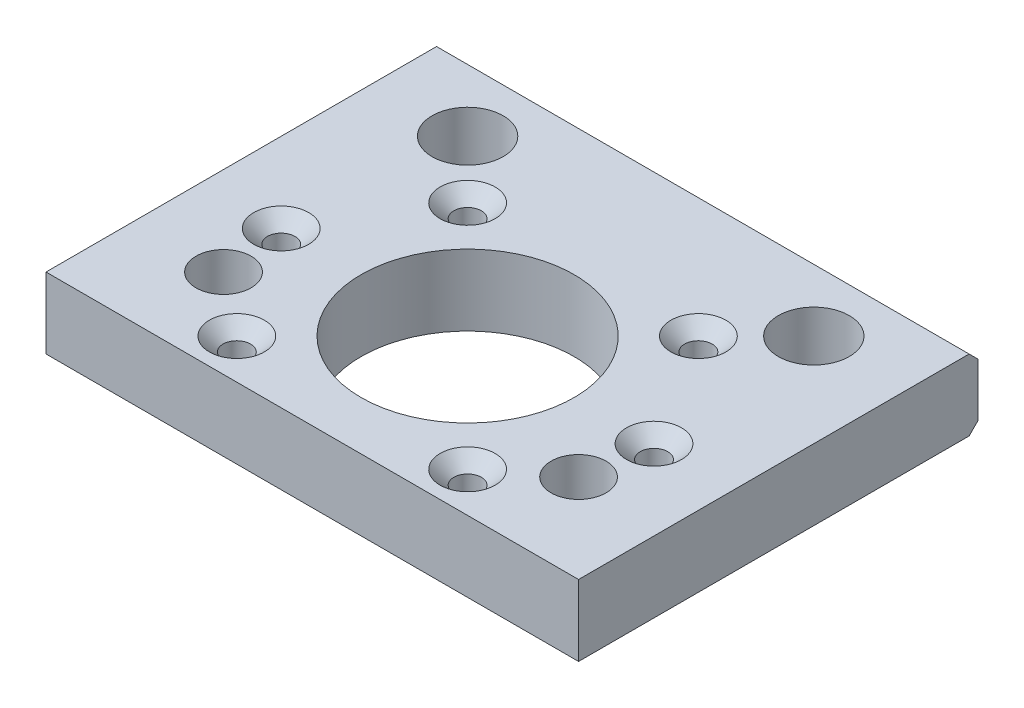
ISO-10303-21;
HEADER;
FILE_DESCRIPTION(('STEP AP214'),'2;1');
FILE_NAME('part.step','',(''),(''),'','','');
FILE_SCHEMA(('AUTOMOTIVE_DESIGN { 1 0 10303 214 1 1 1 1 }'));
ENDSEC;
DATA;
#1=APPLICATION_CONTEXT('core data for automotive mechanical design processes');
#2=APPLICATION_PROTOCOL_DEFINITION('international standard','automotive_design',2000,#1);
#3=PRODUCT_CONTEXT('',#1,'mechanical');
#4=PRODUCT('Part','Part','',(#3));
#5=PRODUCT_RELATED_PRODUCT_CATEGORY('part','',(#4));
#6=PRODUCT_DEFINITION_FORMATION('','',#4);
#7=PRODUCT_DEFINITION_CONTEXT('part definition',#1,'design');
#8=PRODUCT_DEFINITION('design','',#6,#7);
#9=PRODUCT_DEFINITION_SHAPE('','',#8);
#10=(LENGTH_UNIT() NAMED_UNIT(*) SI_UNIT(.MILLI.,.METRE.));
#11=(NAMED_UNIT(*) PLANE_ANGLE_UNIT() SI_UNIT($,.RADIAN.));
#12=(NAMED_UNIT(*) SI_UNIT($,.STERADIAN.) SOLID_ANGLE_UNIT());
#13=UNCERTAINTY_MEASURE_WITH_UNIT(LENGTH_MEASURE(1.E-05),#10,'distance_accuracy_value','');
#14=(GEOMETRIC_REPRESENTATION_CONTEXT(3) GLOBAL_UNCERTAINTY_ASSIGNED_CONTEXT((#13)) GLOBAL_UNIT_ASSIGNED_CONTEXT((#10,
#11,#12)) REPRESENTATION_CONTEXT('',''));
#15=CARTESIAN_POINT('',(0.,0.,0.));
#16=DIRECTION('',(0.,0.,1.));
#17=DIRECTION('',(1.,0.,0.));
#18=AXIS2_PLACEMENT_3D('',#15,#16,#17);
#19=CARTESIAN_POINT('',(0.,8.,0.));
#20=DIRECTION('',(0.,1.,0.));
#21=DIRECTION('',(0.,0.,1.));
#22=AXIS2_PLACEMENT_3D('',#19,#20,#21);
#23=PLANE('',#22);
#24=CARTESIAN_POINT('',(-13.,8.,-8.));
#25=DIRECTION('',(0.,1.,0.));
#26=DIRECTION('',(0.,0.,1.));
#27=AXIS2_PLACEMENT_3D('',#24,#25,#26);
#28=CIRCLE('',#27,3.1);
#29=CARTESIAN_POINT('',(-13.,8.,-4.9));
#30=VERTEX_POINT('',#29);
#31=EDGE_CURVE('E577',#30,#30,#28,.T.);
#32=ORIENTED_EDGE('',*,*,#31,.F.);
#33=EDGE_LOOP('',(#32));
#34=FACE_BOUND('',#33,.T.);
#35=CARTESIAN_POINT('',(-13.,8.,18.));
#36=DIRECTION('',(0.,1.,0.));
#37=DIRECTION('',(0.,0.,1.));
#38=AXIS2_PLACEMENT_3D('',#35,#36,#37);
#39=CIRCLE('',#38,3.1);
#40=CARTESIAN_POINT('',(-13.,8.,21.1));
#41=VERTEX_POINT('',#40);
#42=EDGE_CURVE('E588',#41,#41,#39,.T.);
#43=ORIENTED_EDGE('',*,*,#42,.F.);
#44=EDGE_LOOP('',(#43));
#45=FACE_BOUND('',#44,.T.);
#46=CARTESIAN_POINT('',(13.,8.,18.));
#47=DIRECTION('',(0.,1.,0.));
#48=DIRECTION('',(0.,0.,1.));
#49=AXIS2_PLACEMENT_3D('',#46,#47,#48);
#50=CIRCLE('',#49,3.1);
#51=CARTESIAN_POINT('',(13.,8.,21.1));
#52=VERTEX_POINT('',#51);
#53=EDGE_CURVE('E600',#52,#52,#50,.T.);
#54=ORIENTED_EDGE('',*,*,#53,.F.);
#55=EDGE_LOOP('',(#54));
#56=FACE_BOUND('',#55,.T.);
#57=CARTESIAN_POINT('',(13.,8.,-8.));
#58=DIRECTION('',(0.,1.,0.));
#59=DIRECTION('',(0.,0.,1.));
#60=AXIS2_PLACEMENT_3D('',#57,#58,#59);
#61=CIRCLE('',#60,3.1);
#62=CARTESIAN_POINT('',(13.,8.,-4.9));
#63=VERTEX_POINT('',#62);
#64=EDGE_CURVE('E612',#63,#63,#61,.T.);
#65=ORIENTED_EDGE('',*,*,#64,.F.);
#66=EDGE_LOOP('',(#65));
#67=FACE_BOUND('',#66,.T.);
#68=CARTESIAN_POINT('',(-21.,8.,4.99999999999999));
#69=DIRECTION('',(0.,1.,0.));
#70=DIRECTION('',(0.,0.,1.));
#71=AXIS2_PLACEMENT_3D('',#68,#69,#70);
#72=CIRCLE('',#71,3.1);
#73=CARTESIAN_POINT('',(-21.,8.,8.09999999999999));
#74=VERTEX_POINT('',#73);
#75=EDGE_CURVE('E624',#74,#74,#72,.T.);
#76=ORIENTED_EDGE('',*,*,#75,.F.);
#77=EDGE_LOOP('',(#76));
#78=FACE_BOUND('',#77,.T.);
#79=CARTESIAN_POINT('',(21.,8.,5.));
#80=DIRECTION('',(0.,1.,0.));
#81=DIRECTION('',(0.,0.,1.));
#82=AXIS2_PLACEMENT_3D('',#79,#80,#81);
#83=CIRCLE('',#82,3.1);
#84=CARTESIAN_POINT('',(21.,8.,8.09999999999999));
#85=VERTEX_POINT('',#84);
#86=EDGE_CURVE('E632',#85,#85,#83,.T.);
#87=ORIENTED_EDGE('',*,*,#86,.F.);
#88=EDGE_LOOP('',(#87));
#89=FACE_BOUND('',#88,.T.);
#90=CARTESIAN_POINT('',(20.,8.,12.5));
#91=DIRECTION('',(0.,-1.,0.));
#92=DIRECTION('',(0.,0.,-1.));
#93=AXIS2_PLACEMENT_3D('',#90,#91,#92);
#94=CIRCLE('',#93,3.1);
#95=CARTESIAN_POINT('',(20.,8.,9.4));
#96=VERTEX_POINT('',#95);
#97=EDGE_CURVE('E640',#96,#96,#94,.T.);
#98=ORIENTED_EDGE('',*,*,#97,.T.);
#99=EDGE_LOOP('',(#98));
#100=FACE_BOUND('',#99,.T.);
#101=CARTESIAN_POINT('',(0.,8.,5.));
#102=DIRECTION('',(0.,1.,0.));
#103=DIRECTION('',(0.,0.,1.));
#104=AXIS2_PLACEMENT_3D('',#101,#102,#103);
#105=CIRCLE('',#104,12.);
#106=CARTESIAN_POINT('',(0.,8.,17.));
#107=VERTEX_POINT('',#106);
#108=EDGE_CURVE('E153',#107,#107,#105,.T.);
#109=ORIENTED_EDGE('',*,*,#108,.F.);
#110=EDGE_LOOP('',(#109));
#111=FACE_BOUND('',#110,.T.);
#112=DIRECTION('',(0.,0.,-1.));
#113=VECTOR('',#112,1.);
#114=CARTESIAN_POINT('',(30.,8.,-22.5));
#115=LINE('',#114,#113);
#116=CARTESIAN_POINT('',(30.,8.,22.5));
#117=VERTEX_POINT('',#116);
#118=CARTESIAN_POINT('',(30.,8.,-21.5));
#119=VERTEX_POINT('',#118);
#120=EDGE_CURVE('E167',#117,#119,#115,.T.);
#121=ORIENTED_EDGE('',*,*,#120,.T.);
#122=DIRECTION('',(-1.,0.,0.));
#123=VECTOR('',#122,1.);
#124=CARTESIAN_POINT('',(-30.,8.,-21.5));
#125=LINE('',#124,#123);
#126=CARTESIAN_POINT('',(-30.,8.,-21.5));
#127=VERTEX_POINT('',#126);
#128=EDGE_CURVE('E217',#119,#127,#125,.T.);
#129=ORIENTED_EDGE('',*,*,#128,.T.);
#130=DIRECTION('',(0.,0.,1.));
#131=VECTOR('',#130,1.);
#132=CARTESIAN_POINT('',(-30.,8.,-22.5));
#133=LINE('',#132,#131);
#134=CARTESIAN_POINT('',(-30.,8.,22.5));
#135=VERTEX_POINT('',#134);
#136=EDGE_CURVE('E160',#127,#135,#133,.T.);
#137=ORIENTED_EDGE('',*,*,#136,.T.);
#138=DIRECTION('',(1.,0.,0.));
#139=VECTOR('',#138,1.);
#140=CARTESIAN_POINT('',(-30.,8.,22.5));
#141=LINE('',#140,#139);
#142=EDGE_CURVE('E163',#135,#117,#141,.T.);
#143=ORIENTED_EDGE('',*,*,#142,.T.);
#144=EDGE_LOOP('',(#121,#129,#137,#143));
#145=FACE_BOUND('',#144,.T.);
#146=CARTESIAN_POINT('',(19.5,8.,-14.5));
#147=DIRECTION('',(0.,1.,0.));
#148=DIRECTION('',(0.,0.,-1.));
#149=AXIS2_PLACEMENT_3D('',#146,#147,#148);
#150=CIRCLE('',#149,4.);
#151=CARTESIAN_POINT('',(19.5,8.,-18.5));
#152=VERTEX_POINT('',#151);
#153=EDGE_CURVE('E130',#152,#152,#150,.T.);
#154=ORIENTED_EDGE('',*,*,#153,.F.);
#155=EDGE_LOOP('',(#154));
#156=FACE_BOUND('',#155,.T.);
#157=CARTESIAN_POINT('',(-19.5,8.,-14.5));
#158=DIRECTION('',(0.,1.,0.));
#159=DIRECTION('',(0.,0.,1.));
#160=AXIS2_PLACEMENT_3D('',#157,#158,#159);
#161=CIRCLE('',#160,4.);
#162=CARTESIAN_POINT('',(-19.5,8.,-10.5));
#163=VERTEX_POINT('',#162);
#164=EDGE_CURVE('E142',#163,#163,#161,.T.);
#165=ORIENTED_EDGE('',*,*,#164,.F.);
#166=EDGE_LOOP('',(#165));
#167=FACE_BOUND('',#166,.T.);
#168=CARTESIAN_POINT('',(-20.,8.,12.5));
#169=DIRECTION('',(0.,-1.,0.));
#170=DIRECTION('',(0.,0.,-1.));
#171=AXIS2_PLACEMENT_3D('',#168,#169,#170);
#172=CIRCLE('',#171,3.1);
#173=CARTESIAN_POINT('',(-20.,8.,9.4));
#174=VERTEX_POINT('',#173);
#175=EDGE_CURVE('E124',#174,#174,#172,.T.);
#176=ORIENTED_EDGE('',*,*,#175,.T.);
#177=EDGE_LOOP('',(#176));
#178=FACE_BOUND('',#177,.T.);
#179=ADVANCED_FACE('F40',(#34,#45,#56,#67,#78,#89,#100,#111,#145,#156,#167,#178),#23,.T.);
#180=CARTESIAN_POINT('',(0.,0.,0.));
#181=DIRECTION('',(0.,1.,0.));
#182=DIRECTION('',(0.,0.,1.));
#183=AXIS2_PLACEMENT_3D('',#180,#181,#182);
#184=PLANE('',#183);
#185=CARTESIAN_POINT('',(-13.,0.,-8.));
#186=DIRECTION('',(0.,1.,0.));
#187=DIRECTION('',(0.,0.,1.));
#188=AXIS2_PLACEMENT_3D('',#185,#186,#187);
#189=CIRCLE('',#188,1.55);
#190=CARTESIAN_POINT('',(-13.,0.,-6.45));
#191=VERTEX_POINT('',#190);
#192=EDGE_CURVE('E582',#191,#191,#189,.T.);
#193=ORIENTED_EDGE('',*,*,#192,.T.);
#194=EDGE_LOOP('',(#193));
#195=FACE_BOUND('',#194,.T.);
#196=CARTESIAN_POINT('',(-13.,0.,18.));
#197=DIRECTION('',(0.,1.,0.));
#198=DIRECTION('',(0.,0.,1.));
#199=AXIS2_PLACEMENT_3D('',#196,#197,#198);
#200=CIRCLE('',#199,1.55);
#201=CARTESIAN_POINT('',(-13.,0.,19.55));
#202=VERTEX_POINT('',#201);
#203=EDGE_CURVE('E596',#202,#202,#200,.T.);
#204=ORIENTED_EDGE('',*,*,#203,.T.);
#205=EDGE_LOOP('',(#204));
#206=FACE_BOUND('',#205,.T.);
#207=CARTESIAN_POINT('',(13.,0.,18.));
#208=DIRECTION('',(0.,1.,0.));
#209=DIRECTION('',(0.,0.,1.));
#210=AXIS2_PLACEMENT_3D('',#207,#208,#209);
#211=CIRCLE('',#210,1.55);
#212=CARTESIAN_POINT('',(13.,0.,19.55));
#213=VERTEX_POINT('',#212);
#214=EDGE_CURVE('E608',#213,#213,#211,.T.);
#215=ORIENTED_EDGE('',*,*,#214,.T.);
#216=EDGE_LOOP('',(#215));
#217=FACE_BOUND('',#216,.T.);
#218=CARTESIAN_POINT('',(13.,0.,-8.));
#219=DIRECTION('',(0.,1.,0.));
#220=DIRECTION('',(0.,0.,1.));
#221=AXIS2_PLACEMENT_3D('',#218,#219,#220);
#222=CIRCLE('',#221,1.55);
#223=CARTESIAN_POINT('',(13.,0.,-6.45));
#224=VERTEX_POINT('',#223);
#225=EDGE_CURVE('E620',#224,#224,#222,.T.);
#226=ORIENTED_EDGE('',*,*,#225,.T.);
#227=EDGE_LOOP('',(#226));
#228=FACE_BOUND('',#227,.T.);
#229=CARTESIAN_POINT('',(0.,0.,5.));
#230=DIRECTION('',(0.,1.,0.));
#231=DIRECTION('',(0.,0.,1.));
#232=AXIS2_PLACEMENT_3D('',#229,#230,#231);
#233=CIRCLE('',#232,12.);
#234=CARTESIAN_POINT('',(0.,0.,17.));
#235=VERTEX_POINT('',#234);
#236=EDGE_CURVE('E141',#235,#235,#233,.T.);
#237=ORIENTED_EDGE('',*,*,#236,.T.);
#238=EDGE_LOOP('',(#237));
#239=FACE_BOUND('',#238,.T.);
#240=DIRECTION('',(0.,0.,1.));
#241=VECTOR('',#240,1.);
#242=CARTESIAN_POINT('',(-30.,0.,-22.5));
#243=LINE('',#242,#241);
#244=CARTESIAN_POINT('',(-30.,0.,-21.5));
#245=VERTEX_POINT('',#244);
#246=CARTESIAN_POINT('',(-30.,0.,22.5));
#247=VERTEX_POINT('',#246);
#248=EDGE_CURVE('E157',#245,#247,#243,.T.);
#249=ORIENTED_EDGE('',*,*,#248,.F.);
#250=DIRECTION('',(1.,0.,0.));
#251=VECTOR('',#250,1.);
#252=CARTESIAN_POINT('',(0.,0.,-21.5));
#253=LINE('',#252,#251);
#254=CARTESIAN_POINT('',(30.,0.,-21.5));
#255=VERTEX_POINT('',#254);
#256=EDGE_CURVE('E208',#245,#255,#253,.T.);
#257=ORIENTED_EDGE('',*,*,#256,.T.);
#258=DIRECTION('',(0.,0.,-1.));
#259=VECTOR('',#258,1.);
#260=CARTESIAN_POINT('',(30.,0.,-22.5));
#261=LINE('',#260,#259);
#262=CARTESIAN_POINT('',(30.,0.,22.5));
#263=VERTEX_POINT('',#262);
#264=EDGE_CURVE('E164',#263,#255,#261,.T.);
#265=ORIENTED_EDGE('',*,*,#264,.F.);
#266=DIRECTION('',(1.,0.,0.));
#267=VECTOR('',#266,1.);
#268=CARTESIAN_POINT('',(-30.,0.,22.5));
#269=LINE('',#268,#267);
#270=EDGE_CURVE('E174',#247,#263,#269,.T.);
#271=ORIENTED_EDGE('',*,*,#270,.F.);
#272=EDGE_LOOP('',(#249,#257,#265,#271));
#273=FACE_BOUND('',#272,.T.);
#274=CARTESIAN_POINT('',(21.,0.,5.));
#275=DIRECTION('',(0.,-1.,0.));
#276=DIRECTION('',(0.,0.,-1.));
#277=AXIS2_PLACEMENT_3D('',#274,#275,#276);
#278=CIRCLE('',#277,1.55);
#279=CARTESIAN_POINT('',(19.7416791205615,0.,5.90505721607487));
#280=VERTEX_POINT('',#279);
#281=CARTESIAN_POINT('',(21.9772291763817,0.,6.20313055685089));
#282=VERTEX_POINT('',#281);
#283=EDGE_CURVE('E116',#280,#282,#278,.T.);
#284=ORIENTED_EDGE('',*,*,#283,.F.);
#285=CARTESIAN_POINT('',(20.,0.,12.5));
#286=DIRECTION('',(0.,-1.,0.));
#287=DIRECTION('',(0.,0.,-1.));
#288=AXIS2_PLACEMENT_3D('',#285,#286,#287);
#289=CIRCLE('',#288,6.6);
#290=EDGE_CURVE('E62',#282,#280,#289,.T.);
#291=ORIENTED_EDGE('',*,*,#290,.F.);
#292=EDGE_LOOP('',(#284,#291));
#293=FACE_BOUND('',#292,.T.);
#294=CARTESIAN_POINT('',(-20.,0.,12.5));
#295=DIRECTION('',(0.,-1.,0.));
#296=DIRECTION('',(0.,0.,-1.));
#297=AXIS2_PLACEMENT_3D('',#294,#295,#296);
#298=CIRCLE('',#297,6.6);
#299=CARTESIAN_POINT('',(-19.7416791205615,0.,5.90505721607487));
#300=VERTEX_POINT('',#299);
#301=CARTESIAN_POINT('',(-21.9772291763817,0.,6.20313055685089));
#302=VERTEX_POINT('',#301);
#303=EDGE_CURVE('E68',#300,#302,#298,.T.);
#304=ORIENTED_EDGE('',*,*,#303,.F.);
#305=CARTESIAN_POINT('',(-21.,0.,4.99999999999999));
#306=DIRECTION('',(0.,-1.,0.));
#307=DIRECTION('',(0.,0.,-1.));
#308=AXIS2_PLACEMENT_3D('',#305,#306,#307);
#309=CIRCLE('',#308,1.55);
#310=EDGE_CURVE('E123',#302,#300,#309,.T.);
#311=ORIENTED_EDGE('',*,*,#310,.F.);
#312=EDGE_LOOP('',(#304,#311));
#313=FACE_BOUND('',#312,.T.);
#314=ADVANCED_FACE('F114',(#195,#206,#217,#228,#239,#273,#293,#313),#184,.F.);
#315=CARTESIAN_POINT('',(-30.,8.,-22.5));
#316=DIRECTION('',(1.,0.,0.));
#317=DIRECTION('',(0.,0.,-1.));
#318=AXIS2_PLACEMENT_3D('',#315,#316,#317);
#319=PLANE('',#318);
#320=DIRECTION('',(0.,-1.,0.));
#321=VECTOR('',#320,1.);
#322=CARTESIAN_POINT('',(-30.,8.,-22.5));
#323=LINE('',#322,#321);
#324=CARTESIAN_POINT('',(-30.,7.00000000000001,-22.5));
#325=VERTEX_POINT('',#324);
#326=CARTESIAN_POINT('',(-30.,1.,-22.5));
#327=VERTEX_POINT('',#326);
#328=EDGE_CURVE('E171',#325,#327,#323,.T.);
#329=ORIENTED_EDGE('',*,*,#328,.T.);
#330=DIRECTION('',(0.,0.707106781186545,-0.70710678118655));
#331=VECTOR('',#330,1.);
#332=CARTESIAN_POINT('',(-30.,1.,-22.5));
#333=LINE('',#332,#331);
#334=EDGE_CURVE('E205',#327,#245,#333,.F.);
#335=ORIENTED_EDGE('',*,*,#334,.T.);
#336=ORIENTED_EDGE('',*,*,#248,.T.);
#337=DIRECTION('',(0.,-1.,0.));
#338=VECTOR('',#337,1.);
#339=CARTESIAN_POINT('',(-30.,8.,22.5));
#340=LINE('',#339,#338);
#341=EDGE_CURVE('E191',#135,#247,#340,.T.);
#342=ORIENTED_EDGE('',*,*,#341,.F.);
#343=ORIENTED_EDGE('',*,*,#136,.F.);
#344=DIRECTION('',(0.,-0.707106781186548,-0.707106781186548));
#345=VECTOR('',#344,1.);
#346=CARTESIAN_POINT('',(-30.,8.,-21.5));
#347=LINE('',#346,#345);
#348=EDGE_CURVE('E202',#127,#325,#347,.T.);
#349=ORIENTED_EDGE('',*,*,#348,.T.);
#350=EDGE_LOOP('',(#329,#335,#336,#342,#343,#349));
#351=FACE_BOUND('',#350,.T.);
#352=ADVANCED_FACE('F251',(#351),#319,.F.);
#353=CARTESIAN_POINT('',(-30.,8.,22.5));
#354=DIRECTION('',(0.,0.,-1.));
#355=DIRECTION('',(-1.,0.,0.));
#356=AXIS2_PLACEMENT_3D('',#353,#354,#355);
#357=PLANE('',#356);
#358=ORIENTED_EDGE('',*,*,#270,.T.);
#359=DIRECTION('',(0.,-1.,0.));
#360=VECTOR('',#359,1.);
#361=CARTESIAN_POINT('',(30.,8.,22.5));
#362=LINE('',#361,#360);
#363=EDGE_CURVE('E187',#117,#263,#362,.T.);
#364=ORIENTED_EDGE('',*,*,#363,.F.);
#365=ORIENTED_EDGE('',*,*,#142,.F.);
#366=ORIENTED_EDGE('',*,*,#341,.T.);
#367=EDGE_LOOP('',(#358,#364,#365,#366));
#368=FACE_BOUND('',#367,.T.);
#369=ADVANCED_FACE('F267',(#368),#357,.F.);
#370=CARTESIAN_POINT('',(30.,8.,-22.5));
#371=DIRECTION('',(-1.,0.,0.));
#372=DIRECTION('',(0.,0.,1.));
#373=AXIS2_PLACEMENT_3D('',#370,#371,#372);
#374=PLANE('',#373);
#375=ORIENTED_EDGE('',*,*,#264,.T.);
#376=DIRECTION('',(0.,-0.707106781186545,0.70710678118655));
#377=VECTOR('',#376,1.);
#378=CARTESIAN_POINT('',(30.,1.,-22.5));
#379=LINE('',#378,#377);
#380=CARTESIAN_POINT('',(30.,1.,-22.5));
#381=VERTEX_POINT('',#380);
#382=EDGE_CURVE('E214',#255,#381,#379,.F.);
#383=ORIENTED_EDGE('',*,*,#382,.T.);
#384=DIRECTION('',(0.,-1.,0.));
#385=VECTOR('',#384,1.);
#386=CARTESIAN_POINT('',(30.,8.,-22.5));
#387=LINE('',#386,#385);
#388=CARTESIAN_POINT('',(30.,7.00000000000001,-22.5));
#389=VERTEX_POINT('',#388);
#390=EDGE_CURVE('E183',#389,#381,#387,.T.);
#391=ORIENTED_EDGE('',*,*,#390,.F.);
#392=DIRECTION('',(0.,0.707106781186548,0.707106781186548));
#393=VECTOR('',#392,1.);
#394=CARTESIAN_POINT('',(30.,8.,-21.5));
#395=LINE('',#394,#393);
#396=EDGE_CURVE('E211',#389,#119,#395,.T.);
#397=ORIENTED_EDGE('',*,*,#396,.T.);
#398=ORIENTED_EDGE('',*,*,#120,.F.);
#399=ORIENTED_EDGE('',*,*,#363,.T.);
#400=EDGE_LOOP('',(#375,#383,#391,#397,#398,#399));
#401=FACE_BOUND('',#400,.T.);
#402=ADVANCED_FACE('F263',(#401),#374,.F.);
#403=CARTESIAN_POINT('',(-30.,8.,-22.5));
#404=DIRECTION('',(0.,0.,1.));
#405=DIRECTION('',(1.,0.,0.));
#406=AXIS2_PLACEMENT_3D('',#403,#404,#405);
#407=PLANE('',#406);
#408=ORIENTED_EDGE('',*,*,#390,.T.);
#409=DIRECTION('',(-1.,0.,0.));
#410=VECTOR('',#409,1.);
#411=CARTESIAN_POINT('',(-30.,1.,-22.5));
#412=LINE('',#411,#410);
#413=EDGE_CURVE('E198',#381,#327,#412,.T.);
#414=ORIENTED_EDGE('',*,*,#413,.T.);
#415=ORIENTED_EDGE('',*,*,#328,.F.);
#416=DIRECTION('',(1.,0.,0.));
#417=VECTOR('',#416,1.);
#418=CARTESIAN_POINT('',(30.,7.00000000000001,-22.5));
#419=LINE('',#418,#417);
#420=EDGE_CURVE('E195',#325,#389,#419,.T.);
#421=ORIENTED_EDGE('',*,*,#420,.T.);
#422=EDGE_LOOP('',(#408,#414,#415,#421));
#423=FACE_BOUND('',#422,.T.);
#424=ADVANCED_FACE('F260',(#423),#407,.F.);
#425=CARTESIAN_POINT('',(0.,8.,5.));
#426=DIRECTION('',(0.,-1.,0.));
#427=DIRECTION('',(0.,0.,-1.));
#428=AXIS2_PLACEMENT_3D('',#425,#426,#427);
#429=CYLINDRICAL_SURFACE('',#428,12.);
#430=ORIENTED_EDGE('',*,*,#108,.T.);
#431=EDGE_LOOP('',(#430));
#432=FACE_BOUND('',#431,.T.);
#433=ORIENTED_EDGE('',*,*,#236,.F.);
#434=EDGE_LOOP('',(#433));
#435=FACE_BOUND('',#434,.T.);
#436=ADVANCED_FACE('F257',(#432,#435),#429,.F.);
#437=CARTESIAN_POINT('',(-30.,1.,-22.5));
#438=DIRECTION('',(0.,0.70710678118655,0.707106781186545));
#439=DIRECTION('',(-1.,0.,0.));
#440=AXIS2_PLACEMENT_3D('',#437,#438,#439);
#441=PLANE('',#440);
#442=ORIENTED_EDGE('',*,*,#382,.F.);
#443=ORIENTED_EDGE('',*,*,#256,.F.);
#444=ORIENTED_EDGE('',*,*,#334,.F.);
#445=ORIENTED_EDGE('',*,*,#413,.F.);
#446=EDGE_LOOP('',(#442,#443,#444,#445));
#447=FACE_BOUND('',#446,.T.);
#448=ADVANCED_FACE('F275',(#447),#441,.F.);
#449=CARTESIAN_POINT('',(0.,8.,-21.5));
#450=DIRECTION('',(0.,0.707106781186547,-0.707106781186547));
#451=DIRECTION('',(1.,0.,0.));
#452=AXIS2_PLACEMENT_3D('',#449,#450,#451);
#453=PLANE('',#452);
#454=ORIENTED_EDGE('',*,*,#396,.F.);
#455=ORIENTED_EDGE('',*,*,#420,.F.);
#456=ORIENTED_EDGE('',*,*,#348,.F.);
#457=ORIENTED_EDGE('',*,*,#128,.F.);
#458=EDGE_LOOP('',(#454,#455,#456,#457));
#459=FACE_BOUND('',#458,.T.);
#460=ADVANCED_FACE('F43',(#459),#453,.T.);
#461=CARTESIAN_POINT('',(19.5,2.,-14.5));
#462=DIRECTION('',(0.,1.,0.));
#463=DIRECTION('',(0.,0.,1.));
#464=AXIS2_PLACEMENT_3D('',#461,#462,#463);
#465=CYLINDRICAL_SURFACE('',#464,4.);
#466=CARTESIAN_POINT('',(19.5,2.,-14.5));
#467=DIRECTION('',(0.,1.,0.));
#468=DIRECTION('',(0.,0.,-1.));
#469=AXIS2_PLACEMENT_3D('',#466,#467,#468);
#470=CIRCLE('',#469,4.);
#471=CARTESIAN_POINT('',(19.5,2.,-18.5));
#472=VERTEX_POINT('',#471);
#473=EDGE_CURVE('E146',#472,#472,#470,.T.);
#474=ORIENTED_EDGE('',*,*,#473,.F.);
#475=EDGE_LOOP('',(#474));
#476=FACE_BOUND('',#475,.T.);
#477=ORIENTED_EDGE('',*,*,#153,.T.);
#478=EDGE_LOOP('',(#477));
#479=FACE_BOUND('',#478,.T.);
#480=ADVANCED_FACE('F284',(#476,#479),#465,.F.);
#481=CARTESIAN_POINT('',(19.5,2.,-14.5));
#482=DIRECTION('',(0.,-1.,0.));
#483=DIRECTION('',(0.,0.,-1.));
#484=AXIS2_PLACEMENT_3D('',#481,#482,#483);
#485=PLANE('',#484);
#486=ORIENTED_EDGE('',*,*,#473,.T.);
#487=EDGE_LOOP('',(#486));
#488=FACE_BOUND('',#487,.T.);
#489=ADVANCED_FACE('F314',(#488),#485,.F.);
#490=CARTESIAN_POINT('',(-19.5,2.,-14.5));
#491=DIRECTION('',(0.,1.,0.));
#492=DIRECTION('',(0.,0.,1.));
#493=AXIS2_PLACEMENT_3D('',#490,#491,#492);
#494=CYLINDRICAL_SURFACE('',#493,4.);
#495=CARTESIAN_POINT('',(-19.5,2.,-14.5));
#496=DIRECTION('',(0.,1.,0.));
#497=DIRECTION('',(0.,0.,1.));
#498=AXIS2_PLACEMENT_3D('',#495,#496,#497);
#499=CIRCLE('',#498,4.);
#500=CARTESIAN_POINT('',(-19.5,2.,-10.5));
#501=VERTEX_POINT('',#500);
#502=EDGE_CURVE('E137',#501,#501,#499,.T.);
#503=ORIENTED_EDGE('',*,*,#502,.F.);
#504=EDGE_LOOP('',(#503));
#505=FACE_BOUND('',#504,.T.);
#506=ORIENTED_EDGE('',*,*,#164,.T.);
#507=EDGE_LOOP('',(#506));
#508=FACE_BOUND('',#507,.T.);
#509=ADVANCED_FACE('F311',(#505,#508),#494,.F.);
#510=CARTESIAN_POINT('',(-19.5,2.,-14.5));
#511=DIRECTION('',(0.,1.,0.));
#512=DIRECTION('',(0.,0.,1.));
#513=AXIS2_PLACEMENT_3D('',#510,#511,#512);
#514=PLANE('',#513);
#515=ORIENTED_EDGE('',*,*,#502,.T.);
#516=EDGE_LOOP('',(#515));
#517=FACE_BOUND('',#516,.T.);
#518=ADVANCED_FACE('F313',(#517),#514,.T.);
#519=CARTESIAN_POINT('',(-21.,8.,4.99999999999999));
#520=DIRECTION('',(0.,-1.,0.));
#521=DIRECTION('',(0.,0.,-1.));
#522=AXIS2_PLACEMENT_3D('',#519,#520,#521);
#523=CYLINDRICAL_SURFACE('',#522,1.55);
#524=CARTESIAN_POINT('',(-21.,6.45,4.99999999999999));
#525=DIRECTION('',(0.,1.,0.));
#526=DIRECTION('',(0.,0.,1.));
#527=AXIS2_PLACEMENT_3D('',#524,#525,#526);
#528=CIRCLE('',#527,1.55);
#529=CARTESIAN_POINT('',(-21.,6.45,6.54999999999999));
#530=VERTEX_POINT('',#529);
#531=EDGE_CURVE('E628',#530,#530,#528,.T.);
#532=ORIENTED_EDGE('',*,*,#531,.T.);
#533=EDGE_LOOP('',(#532));
#534=FACE_BOUND('',#533,.T.);
#535=ORIENTED_EDGE('',*,*,#310,.T.);
#536=CARTESIAN_POINT('',(-19.7415391265259,-0.000200000000024039,5.90486254753676));
#537=CARTESIAN_POINT('',(-19.7640789068499,0.0319894737143906,5.93619795089192));
#538=CARTESIAN_POINT('',(-19.7880416176144,0.0636733057572304,5.96706586171109));
#539=CARTESIAN_POINT('',(-19.8390240945423,0.125769647960979,6.02772307652768));
#540=CARTESIAN_POINT('',(-19.8660508952858,0.156179003819942,6.05750968246368));
#541=CARTESIAN_POINT('',(-19.9236645255164,0.215721579254156,6.11611455912));
#542=CARTESIAN_POINT('',(-19.9542954555677,0.244831307330216,6.14491371835946));
#543=CARTESIAN_POINT('',(-20.018933037301,0.30081666426608,6.20076257200955));
#544=CARTESIAN_POINT('',(-20.0529363481758,0.327694456602378,6.22781395480496));
#545=CARTESIAN_POINT('',(-20.1368743384404,0.387503327612693,6.28882043715936));
#546=CARTESIAN_POINT('',(-20.1882525988424,0.419314557887482,6.32192895669979));
#547=CARTESIAN_POINT('',(-20.2972645917743,0.475976739495551,6.3829447926227));
#548=CARTESIAN_POINT('',(-20.3548679987553,0.500859493640095,6.41087567074627));
#549=CARTESIAN_POINT('',(-20.4658404607515,0.538366743974371,6.45607184442366));
#550=CARTESIAN_POINT('',(-20.5183400124542,0.552336397456293,6.47433653496691));
#551=CARTESIAN_POINT('',(-20.6263664302082,0.5729575489194,6.5053401144818));
#552=CARTESIAN_POINT('',(-20.6818928220637,0.579610189771966,6.51807986622582));
#553=CARTESIAN_POINT('',(-20.794546357043,0.584953808552159,6.53738803287034));
#554=CARTESIAN_POINT('',(-20.8516773203954,0.583623835971915,6.54394015609076));
#555=CARTESIAN_POINT('',(-20.9655790335481,0.573089407496946,6.55066882768448));
#556=CARTESIAN_POINT('',(-21.022349671927,0.563882625017967,6.55084349167297));
#557=CARTESIAN_POINT('',(-21.1319702739787,0.538904178426314,6.5453136139675));
#558=CARTESIAN_POINT('',(-21.1848879027368,0.523375152786903,6.53981592351621));
#559=CARTESIAN_POINT('',(-21.28800688623,0.486873958704777,6.52390249089246));
#560=CARTESIAN_POINT('',(-21.3382069672266,0.465899264071793,6.51348446438426));
#561=CARTESIAN_POINT('',(-21.4640454616568,0.405961867515555,6.48105477578378));
#562=CARTESIAN_POINT('',(-21.5372702369398,0.363677076102752,6.45582832177987));
#563=CARTESIAN_POINT('',(-21.6753529096649,0.271657077928422,6.39716050490047));
#564=CARTESIAN_POINT('',(-21.740184819951,0.221899714632767,6.3636945160847));
#565=CARTESIAN_POINT('',(-21.8325948840162,0.142473354340882,6.30791918027166));
#566=CARTESIAN_POINT('',(-21.8631674945138,0.114570640367513,6.28792322003507));
#567=CARTESIAN_POINT('',(-21.9219636599746,0.0578511624255341,6.24650114434565));
#568=CARTESIAN_POINT('',(-21.9502011455105,0.0290414882151986,6.22508512940579));
#569=CARTESIAN_POINT('',(-21.9774152846532,-0.000200000000002196,6.20297936862042));
#570=B_SPLINE_CURVE_WITH_KNOTS('',3,(#536,#537,#538,#539,#540,#541,#542,#543,#544,#545,#546,
#547,#548,#549,#550,#551,#552,#553,#554,#555,#556,#557,#558,#559,#560,#561,#562,#563,#564,#565,
#566,#567,#568,#569),.UNSPECIFIED.,.F.,.F.,(4,2,2,2,2,2,2,2,2,2,2,2,2,2,2,2,4),(0.,
0.150789838653387,0.301933154371546,0.455168650018706,0.608253832961076,0.814264779764228,
1.01931390042089,1.19053104544893,1.36172144363561,1.53336133011887,1.70505193162313,
1.87069552341398,2.03641609329825,2.29965430210396,2.56368902455773,2.70151744881648,
2.83845327778439),.UNSPECIFIED.);
#571=EDGE_CURVE('E56',#300,#302,#570,.T.);
#572=ORIENTED_EDGE('',*,*,#571,.T.);
#573=EDGE_LOOP('',(#535,#572));
#574=FACE_BOUND('',#573,.T.);
#575=ADVANCED_FACE('F227',(#534,#574),#523,.F.);
#576=CARTESIAN_POINT('',(21.,8.,5.));
#577=DIRECTION('',(0.,-1.,0.));
#578=DIRECTION('',(0.,0.,-1.));
#579=AXIS2_PLACEMENT_3D('',#576,#577,#578);
#580=CYLINDRICAL_SURFACE('',#579,1.55);
#581=CARTESIAN_POINT('',(21.,6.45,5.));
#582=DIRECTION('',(0.,1.,0.));
#583=DIRECTION('',(0.,0.,1.));
#584=AXIS2_PLACEMENT_3D('',#581,#582,#583);
#585=CIRCLE('',#584,1.55);
#586=CARTESIAN_POINT('',(21.,6.45,6.55));
#587=VERTEX_POINT('',#586);
#588=EDGE_CURVE('E119',#587,#587,#585,.T.);
#589=ORIENTED_EDGE('',*,*,#588,.T.);
#590=EDGE_LOOP('',(#589));
#591=FACE_BOUND('',#590,.T.);
#592=ORIENTED_EDGE('',*,*,#283,.T.);
#593=CARTESIAN_POINT('',(21.9774152846532,-0.000200000000002385,6.20297936862042));
#594=CARTESIAN_POINT('',(21.947452770885,0.0319894737144118,6.22731446609662));
#595=CARTESIAN_POINT('',(21.9162395231639,0.0636733057572498,6.25082558245104));
#596=CARTESIAN_POINT('',(21.8511453734257,0.125769647960995,6.29600591371215));
#597=CARTESIAN_POINT('',(21.8172583894935,0.156179003819957,6.31767068169138));
#598=CARTESIAN_POINT('',(21.7463024729855,0.215721579254169,6.35913295211589));
#599=CARTESIAN_POINT('',(21.7091959878514,0.24483130733023,6.3789004559973));
#600=CARTESIAN_POINT('',(21.6321836001568,0.300816664266093,6.415862647057));
#601=CARTESIAN_POINT('',(21.5922804793225,0.32769445660239,6.43305983895786));
#602=CARTESIAN_POINT('',(21.495290589411,0.387503327612703,6.46994260395545));
#603=CARTESIAN_POINT('',(21.4370324814579,0.419314557887493,6.48843294104853));
#604=CARTESIAN_POINT('',(21.3158420858537,0.475976739495563,6.51875512516663));
#605=CARTESIAN_POINT('',(21.252932890962,0.500859493640106,6.53061765637383));
#606=CARTESIAN_POINT('',(21.1339954039673,0.538366743974381,6.54515917018578));
#607=CARTESIAN_POINT('',(21.0785443892996,0.552336397456303,6.54903045187964));
#608=CARTESIAN_POINT('',(20.9661686115942,0.572957548919409,6.55064707199995));
#609=CARTESIAN_POINT('',(20.9092440801327,0.579610189771974,6.5483933673017));
#610=CARTESIAN_POINT('',(20.7954671315339,0.584953808552166,6.53751080280247));
#611=CARTESIAN_POINT('',(20.7386152961885,0.583623835971922,6.52886521952984));
#612=CARTESIAN_POINT('',(20.626929711462,0.573089407496951,6.50551558473967));
#613=CARTESIAN_POINT('',(20.5720965633351,0.563882625017972,6.49080974386072));
#614=CARTESIAN_POINT('',(20.4677543782212,0.538904178426317,6.45675149453315));
#615=CARTESIAN_POINT('',(20.4181258431625,0.523375152786906,6.43758098223964));
#616=CARTESIAN_POINT('',(20.3227787279023,0.486873958704779,6.39520540311544));
#617=CARTESIAN_POINT('',(20.2770619754579,0.465899264071794,6.37199846548177));
#618=CARTESIAN_POINT('',(20.1641164472786,0.405961867515554,6.30773090720002));
#619=CARTESIAN_POINT('',(20.1000592940153,0.36367707610275,6.26420019605659));
#620=CARTESIAN_POINT('',(19.9821719505241,0.271657077928417,6.17140304368169));
#621=CARTESIAN_POINT('',(19.9283732918155,0.221899714632759,6.12211964566664));
#622=CARTESIAN_POINT('',(19.8538051520355,0.142473354340871,6.04408054934089));
#623=CARTESIAN_POINT('',(19.8295396965517,0.1145706403675,6.01677284697344));
#624=CARTESIAN_POINT('',(19.7836504912003,0.0578511624255185,5.9613927218424));
#625=CARTESIAN_POINT('',(19.7620106509949,0.0290414882151811,5.93332639680368));
#626=CARTESIAN_POINT('',(19.7415391265259,-0.000200000000022685,5.90486254753676));
#627=B_SPLINE_CURVE_WITH_KNOTS('',3,(#593,#594,#595,#596,#597,#598,#599,#600,#601,#602,#603,
#604,#605,#606,#607,#608,#609,#610,#611,#612,#613,#614,#615,#616,#617,#618,#619,#620,#621,#622,
#623,#624,#625,#626),.UNSPECIFIED.,.F.,.F.,(4,2,2,2,2,2,2,2,2,2,2,2,2,2,2,2,4),(0.,
0.150789838653381,0.301933154371538,0.455168650018694,0.608253832961064,0.814264779764215,
1.01931390042088,1.19053104544892,1.3617214436356,1.53336133011886,1.70505193162313,
1.87069552341398,2.03641609329825,2.29965430210396,2.56368902455774,2.70151744881649,
2.83845327778442),.UNSPECIFIED.);
#628=EDGE_CURVE('E11',#282,#280,#627,.T.);
#629=ORIENTED_EDGE('',*,*,#628,.T.);
#630=EDGE_LOOP('',(#592,#629));
#631=FACE_BOUND('',#630,.T.);
#632=ADVANCED_FACE('F121',(#591,#631),#580,.F.);
#633=CARTESIAN_POINT('',(-20.,0.,12.5));
#634=DIRECTION('',(0.,-1.,0.));
#635=DIRECTION('',(0.,0.,-1.));
#636=AXIS2_PLACEMENT_3D('',#633,#634,#635);
#637=CONICAL_SURFACE('',#636,6.6,0.785398163397449);
#638=CARTESIAN_POINT('',(-20.,3.5,12.5));
#639=DIRECTION('',(0.,-1.,0.));
#640=DIRECTION('',(0.,0.,-1.));
#641=AXIS2_PLACEMENT_3D('',#638,#639,#640);
#642=CIRCLE('',#641,3.1);
#643=CARTESIAN_POINT('',(-20.,3.5,9.4));
#644=VERTEX_POINT('',#643);
#645=EDGE_CURVE('E134',#644,#644,#642,.T.);
#646=ORIENTED_EDGE('',*,*,#645,.F.);
#647=EDGE_LOOP('',(#646));
#648=FACE_BOUND('',#647,.T.);
#649=ORIENTED_EDGE('',*,*,#303,.T.);
#650=ORIENTED_EDGE('',*,*,#571,.F.);
#651=EDGE_LOOP('',(#649,#650));
#652=FACE_BOUND('',#651,.T.);
#653=ADVANCED_FACE('F230',(#648,#652),#637,.F.);
#654=CARTESIAN_POINT('',(-20.,0.,12.5));
#655=DIRECTION('',(0.,-1.,0.));
#656=DIRECTION('',(0.,0.,-1.));
#657=AXIS2_PLACEMENT_3D('',#654,#655,#656);
#658=CYLINDRICAL_SURFACE('',#657,3.1);
#659=ORIENTED_EDGE('',*,*,#175,.F.);
#660=EDGE_LOOP('',(#659));
#661=FACE_BOUND('',#660,.T.);
#662=ORIENTED_EDGE('',*,*,#645,.T.);
#663=EDGE_LOOP('',(#662));
#664=FACE_BOUND('',#663,.T.);
#665=ADVANCED_FACE('F234',(#661,#664),#658,.F.);
#666=CARTESIAN_POINT('',(20.,0.,12.5));
#667=DIRECTION('',(0.,-1.,0.));
#668=DIRECTION('',(0.,0.,-1.));
#669=AXIS2_PLACEMENT_3D('',#666,#667,#668);
#670=CONICAL_SURFACE('',#669,6.6,0.785398163397449);
#671=CARTESIAN_POINT('',(20.,3.5,12.5));
#672=DIRECTION('',(0.,-1.,0.));
#673=DIRECTION('',(0.,0.,-1.));
#674=AXIS2_PLACEMENT_3D('',#671,#672,#673);
#675=CIRCLE('',#674,3.1);
#676=CARTESIAN_POINT('',(20.,3.5,9.4));
#677=VERTEX_POINT('',#676);
#678=EDGE_CURVE('E118',#677,#677,#675,.T.);
#679=ORIENTED_EDGE('',*,*,#678,.F.);
#680=EDGE_LOOP('',(#679));
#681=FACE_BOUND('',#680,.T.);
#682=ORIENTED_EDGE('',*,*,#290,.T.);
#683=ORIENTED_EDGE('',*,*,#628,.F.);
#684=EDGE_LOOP('',(#682,#683));
#685=FACE_BOUND('',#684,.T.);
#686=ADVANCED_FACE('F109',(#681,#685),#670,.F.);
#687=CARTESIAN_POINT('',(20.,0.,12.5));
#688=DIRECTION('',(0.,-1.,0.));
#689=DIRECTION('',(0.,0.,-1.));
#690=AXIS2_PLACEMENT_3D('',#687,#688,#689);
#691=CYLINDRICAL_SURFACE('',#690,3.1);
#692=ORIENTED_EDGE('',*,*,#97,.F.);
#693=EDGE_LOOP('',(#692));
#694=FACE_BOUND('',#693,.T.);
#695=ORIENTED_EDGE('',*,*,#678,.T.);
#696=EDGE_LOOP('',(#695));
#697=FACE_BOUND('',#696,.T.);
#698=ADVANCED_FACE('F236',(#694,#697),#691,.F.);
#699=CARTESIAN_POINT('',(21.,8.,5.));
#700=DIRECTION('',(0.,1.,0.));
#701=DIRECTION('',(0.,0.,1.));
#702=AXIS2_PLACEMENT_3D('',#699,#700,#701);
#703=CONICAL_SURFACE('',#702,3.1,0.785398163397447);
#704=ORIENTED_EDGE('',*,*,#588,.F.);
#705=EDGE_LOOP('',(#704));
#706=FACE_BOUND('',#705,.T.);
#707=ORIENTED_EDGE('',*,*,#86,.T.);
#708=EDGE_LOOP('',(#707));
#709=FACE_BOUND('',#708,.T.);
#710=ADVANCED_FACE('F381',(#706,#709),#703,.F.);
#711=CARTESIAN_POINT('',(-21.,8.,4.99999999999999));
#712=DIRECTION('',(0.,1.,0.));
#713=DIRECTION('',(0.,0.,1.));
#714=AXIS2_PLACEMENT_3D('',#711,#712,#713);
#715=CONICAL_SURFACE('',#714,3.1,0.785398163397447);
#716=ORIENTED_EDGE('',*,*,#531,.F.);
#717=EDGE_LOOP('',(#716));
#718=FACE_BOUND('',#717,.T.);
#719=ORIENTED_EDGE('',*,*,#75,.T.);
#720=EDGE_LOOP('',(#719));
#721=FACE_BOUND('',#720,.T.);
#722=ADVANCED_FACE('F389',(#718,#721),#715,.F.);
#723=CARTESIAN_POINT('',(13.,8.,-8.));
#724=DIRECTION('',(0.,1.,0.));
#725=DIRECTION('',(0.,0.,1.));
#726=AXIS2_PLACEMENT_3D('',#723,#724,#725);
#727=CYLINDRICAL_SURFACE('',#726,1.55);
#728=ORIENTED_EDGE('',*,*,#225,.F.);
#729=EDGE_LOOP('',(#728));
#730=FACE_BOUND('',#729,.T.);
#731=CARTESIAN_POINT('',(13.,6.45,-8.));
#732=DIRECTION('',(0.,1.,0.));
#733=DIRECTION('',(0.,0.,1.));
#734=AXIS2_PLACEMENT_3D('',#731,#732,#733);
#735=CIRCLE('',#734,1.55);
#736=CARTESIAN_POINT('',(13.,6.45,-6.45));
#737=VERTEX_POINT('',#736);
#738=EDGE_CURVE('E616',#737,#737,#735,.T.);
#739=ORIENTED_EDGE('',*,*,#738,.T.);
#740=EDGE_LOOP('',(#739));
#741=FACE_BOUND('',#740,.T.);
#742=ADVANCED_FACE('F398',(#730,#741),#727,.F.);
#743=CARTESIAN_POINT('',(13.,8.,-8.));
#744=DIRECTION('',(0.,1.,0.));
#745=DIRECTION('',(0.,0.,1.));
#746=AXIS2_PLACEMENT_3D('',#743,#744,#745);
#747=CONICAL_SURFACE('',#746,3.1,0.785398163397448);
#748=ORIENTED_EDGE('',*,*,#738,.F.);
#749=EDGE_LOOP('',(#748));
#750=FACE_BOUND('',#749,.T.);
#751=ORIENTED_EDGE('',*,*,#64,.T.);
#752=EDGE_LOOP('',(#751));
#753=FACE_BOUND('',#752,.T.);
#754=ADVANCED_FACE('F407',(#750,#753),#747,.F.);
#755=CARTESIAN_POINT('',(13.,8.,18.));
#756=DIRECTION('',(0.,1.,0.));
#757=DIRECTION('',(0.,0.,1.));
#758=AXIS2_PLACEMENT_3D('',#755,#756,#757);
#759=CYLINDRICAL_SURFACE('',#758,1.55);
#760=ORIENTED_EDGE('',*,*,#214,.F.);
#761=EDGE_LOOP('',(#760));
#762=FACE_BOUND('',#761,.T.);
#763=CARTESIAN_POINT('',(13.,6.45,18.));
#764=DIRECTION('',(0.,1.,0.));
#765=DIRECTION('',(0.,0.,1.));
#766=AXIS2_PLACEMENT_3D('',#763,#764,#765);
#767=CIRCLE('',#766,1.55);
#768=CARTESIAN_POINT('',(13.,6.45,19.55));
#769=VERTEX_POINT('',#768);
#770=EDGE_CURVE('E604',#769,#769,#767,.T.);
#771=ORIENTED_EDGE('',*,*,#770,.T.);
#772=EDGE_LOOP('',(#771));
#773=FACE_BOUND('',#772,.T.);
#774=ADVANCED_FACE('F416',(#762,#773),#759,.F.);
#775=CARTESIAN_POINT('',(13.,8.,18.));
#776=DIRECTION('',(0.,1.,0.));
#777=DIRECTION('',(0.,0.,1.));
#778=AXIS2_PLACEMENT_3D('',#775,#776,#777);
#779=CONICAL_SURFACE('',#778,3.1,0.785398163397448);
#780=ORIENTED_EDGE('',*,*,#770,.F.);
#781=EDGE_LOOP('',(#780));
#782=FACE_BOUND('',#781,.T.);
#783=ORIENTED_EDGE('',*,*,#53,.T.);
#784=EDGE_LOOP('',(#783));
#785=FACE_BOUND('',#784,.T.);
#786=ADVANCED_FACE('F425',(#782,#785),#779,.F.);
#787=CARTESIAN_POINT('',(-13.,8.,18.));
#788=DIRECTION('',(0.,1.,0.));
#789=DIRECTION('',(0.,0.,1.));
#790=AXIS2_PLACEMENT_3D('',#787,#788,#789);
#791=CYLINDRICAL_SURFACE('',#790,1.55);
#792=ORIENTED_EDGE('',*,*,#203,.F.);
#793=EDGE_LOOP('',(#792));
#794=FACE_BOUND('',#793,.T.);
#795=CARTESIAN_POINT('',(-13.,6.45,18.));
#796=DIRECTION('',(0.,1.,0.));
#797=DIRECTION('',(0.,0.,1.));
#798=AXIS2_PLACEMENT_3D('',#795,#796,#797);
#799=CIRCLE('',#798,1.55);
#800=CARTESIAN_POINT('',(-13.,6.45,19.55));
#801=VERTEX_POINT('',#800);
#802=EDGE_CURVE('E592',#801,#801,#799,.T.);
#803=ORIENTED_EDGE('',*,*,#802,.T.);
#804=EDGE_LOOP('',(#803));
#805=FACE_BOUND('',#804,.T.);
#806=ADVANCED_FACE('F434',(#794,#805),#791,.F.);
#807=CARTESIAN_POINT('',(-13.,8.,18.));
#808=DIRECTION('',(0.,1.,0.));
#809=DIRECTION('',(0.,0.,1.));
#810=AXIS2_PLACEMENT_3D('',#807,#808,#809);
#811=CONICAL_SURFACE('',#810,3.1,0.785398163397448);
#812=ORIENTED_EDGE('',*,*,#802,.F.);
#813=EDGE_LOOP('',(#812));
#814=FACE_BOUND('',#813,.T.);
#815=ORIENTED_EDGE('',*,*,#42,.T.);
#816=EDGE_LOOP('',(#815));
#817=FACE_BOUND('',#816,.T.);
#818=ADVANCED_FACE('F443',(#814,#817),#811,.F.);
#819=CARTESIAN_POINT('',(-13.,8.,-8.));
#820=DIRECTION('',(0.,1.,0.));
#821=DIRECTION('',(0.,0.,1.));
#822=AXIS2_PLACEMENT_3D('',#819,#820,#821);
#823=CYLINDRICAL_SURFACE('',#822,1.55);
#824=ORIENTED_EDGE('',*,*,#192,.F.);
#825=EDGE_LOOP('',(#824));
#826=FACE_BOUND('',#825,.T.);
#827=CARTESIAN_POINT('',(-13.,6.45,-8.));
#828=DIRECTION('',(0.,1.,0.));
#829=DIRECTION('',(0.,0.,1.));
#830=AXIS2_PLACEMENT_3D('',#827,#828,#829);
#831=CIRCLE('',#830,1.55);
#832=CARTESIAN_POINT('',(-13.,6.45,-6.45));
#833=VERTEX_POINT('',#832);
#834=EDGE_CURVE('E575',#833,#833,#831,.T.);
#835=ORIENTED_EDGE('',*,*,#834,.T.);
#836=EDGE_LOOP('',(#835));
#837=FACE_BOUND('',#836,.T.);
#838=ADVANCED_FACE('F452',(#826,#837),#823,.F.);
#839=CARTESIAN_POINT('',(-13.,8.,-8.));
#840=DIRECTION('',(0.,1.,0.));
#841=DIRECTION('',(0.,0.,1.));
#842=AXIS2_PLACEMENT_3D('',#839,#840,#841);
#843=CONICAL_SURFACE('',#842,3.1,0.785398163397448);
#844=ORIENTED_EDGE('',*,*,#834,.F.);
#845=EDGE_LOOP('',(#844));
#846=FACE_BOUND('',#845,.T.);
#847=ORIENTED_EDGE('',*,*,#31,.T.);
#848=EDGE_LOOP('',(#847));
#849=FACE_BOUND('',#848,.T.);
#850=ADVANCED_FACE('F461',(#846,#849),#843,.F.);
#851=CLOSED_SHELL('',(#179,#314,#352,#369,#402,#424,#436,#448,#460,#480,#489,#509,#518,#575,
#632,#653,#665,#686,#698,#710,#722,#742,#754,#774,#786,#806,#818,#838,#850));
#852=MANIFOLD_SOLID_BREP('B2',#851);
#853=ADVANCED_BREP_SHAPE_REPRESENTATION('',(#18,#852),#14);
#854=SHAPE_DEFINITION_REPRESENTATION(#9,#853);
ENDSEC;
END-ISO-10303-21;
